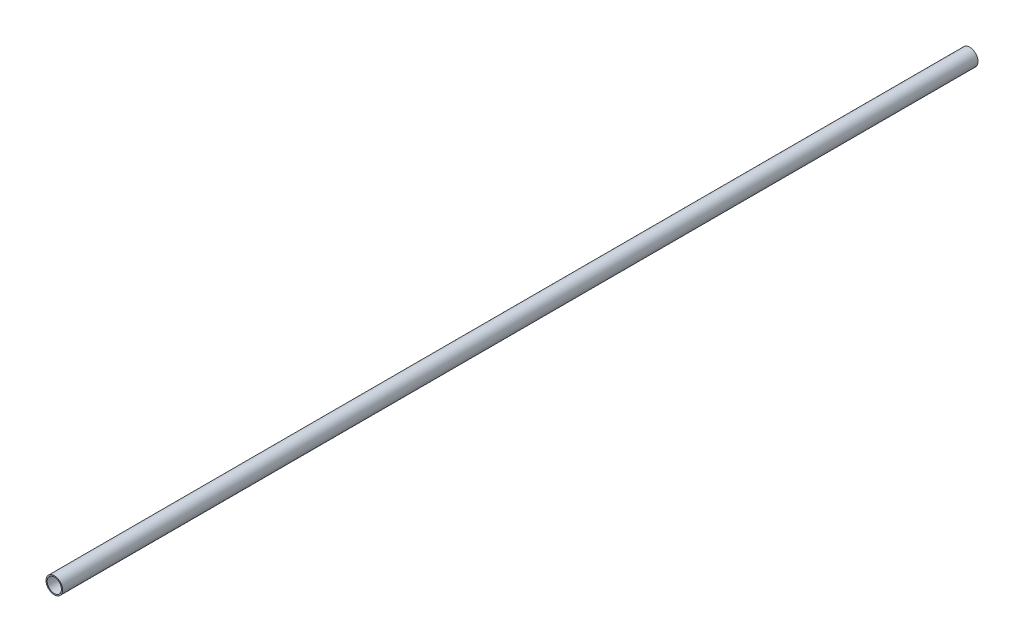
ISO-10303-21;
HEADER;
FILE_DESCRIPTION(('STEP AP214'),'2;1');
FILE_NAME('part.step','',(''),(''),'','','');
FILE_SCHEMA(('AUTOMOTIVE_DESIGN { 1 0 10303 214 1 1 1 1 }'));
ENDSEC;
DATA;
#1=APPLICATION_CONTEXT('core data for automotive mechanical design processes');
#2=APPLICATION_PROTOCOL_DEFINITION('international standard','automotive_design',2000,#1);
#3=PRODUCT_CONTEXT('',#1,'mechanical');
#4=PRODUCT('Part','Part','',(#3));
#5=PRODUCT_RELATED_PRODUCT_CATEGORY('part','',(#4));
#6=PRODUCT_DEFINITION_FORMATION('','',#4);
#7=PRODUCT_DEFINITION_CONTEXT('part definition',#1,'design');
#8=PRODUCT_DEFINITION('design','',#6,#7);
#9=PRODUCT_DEFINITION_SHAPE('','',#8);
#10=(LENGTH_UNIT() NAMED_UNIT(*) SI_UNIT(.MILLI.,.METRE.));
#11=(NAMED_UNIT(*) PLANE_ANGLE_UNIT() SI_UNIT($,.RADIAN.));
#12=(NAMED_UNIT(*) SI_UNIT($,.STERADIAN.) SOLID_ANGLE_UNIT());
#13=UNCERTAINTY_MEASURE_WITH_UNIT(LENGTH_MEASURE(1.E-05),#10,'distance_accuracy_value','');
#14=(GEOMETRIC_REPRESENTATION_CONTEXT(3) GLOBAL_UNCERTAINTY_ASSIGNED_CONTEXT((#13)) GLOBAL_UNIT_ASSIGNED_CONTEXT((#10,
#11,#12)) REPRESENTATION_CONTEXT('',''));
#15=CARTESIAN_POINT('',(0.,0.,0.));
#16=DIRECTION('',(0.,0.,1.));
#17=DIRECTION('',(1.,0.,0.));
#18=AXIS2_PLACEMENT_3D('',#15,#16,#17);
#19=CARTESIAN_POINT('',(0.,0.,609.6));
#20=DIRECTION('',(0.,0.,1.));
#21=DIRECTION('',(1.,0.,0.));
#22=AXIS2_PLACEMENT_3D('',#19,#20,#21);
#23=PLANE('',#22);
#24=CARTESIAN_POINT('',(0.,0.,609.6));
#25=DIRECTION('',(0.,0.,1.));
#26=DIRECTION('',(1.,0.,0.));
#27=AXIS2_PLACEMENT_3D('',#24,#25,#26);
#28=CIRCLE('',#27,5.5245);
#29=CARTESIAN_POINT('',(-5.5245,0.,609.6));
#30=VERTEX_POINT('',#29);
#31=EDGE_CURVE('E10',#30,#30,#28,.T.);
#32=ORIENTED_EDGE('',*,*,#31,.T.);
#33=EDGE_LOOP('',(#32));
#34=FACE_BOUND('',#33,.T.);
#35=CARTESIAN_POINT('',(0.,0.,609.6));
#36=DIRECTION('',(0.,0.,1.));
#37=DIRECTION('',(1.,0.,0.));
#38=AXIS2_PLACEMENT_3D('',#35,#36,#37);
#39=CIRCLE('',#38,4.7625);
#40=CARTESIAN_POINT('',(-4.7625,0.,609.6));
#41=VERTEX_POINT('',#40);
#42=EDGE_CURVE('E47',#41,#41,#39,.T.);
#43=ORIENTED_EDGE('',*,*,#42,.F.);
#44=EDGE_LOOP('',(#43));
#45=FACE_BOUND('',#44,.T.);
#46=ADVANCED_FACE('F36',(#34,#45),#23,.T.);
#47=CARTESIAN_POINT('',(0.,0.,0.));
#48=DIRECTION('',(0.,0.,1.));
#49=DIRECTION('',(1.,0.,0.));
#50=AXIS2_PLACEMENT_3D('',#47,#48,#49);
#51=PLANE('',#50);
#52=CARTESIAN_POINT('',(0.,0.,0.));
#53=DIRECTION('',(0.,0.,1.));
#54=DIRECTION('',(1.,0.,0.));
#55=AXIS2_PLACEMENT_3D('',#52,#53,#54);
#56=CIRCLE('',#55,5.5245);
#57=CARTESIAN_POINT('',(-5.5245,0.,0.));
#58=VERTEX_POINT('',#57);
#59=EDGE_CURVE('E40',#58,#58,#56,.T.);
#60=ORIENTED_EDGE('',*,*,#59,.F.);
#61=EDGE_LOOP('',(#60));
#62=FACE_BOUND('',#61,.T.);
#63=CARTESIAN_POINT('',(0.,0.,0.));
#64=DIRECTION('',(0.,0.,1.));
#65=DIRECTION('',(1.,0.,0.));
#66=AXIS2_PLACEMENT_3D('',#63,#64,#65);
#67=CIRCLE('',#66,4.7625);
#68=CARTESIAN_POINT('',(-4.7625,0.,0.));
#69=VERTEX_POINT('',#68);
#70=EDGE_CURVE('E49',#69,#69,#67,.T.);
#71=ORIENTED_EDGE('',*,*,#70,.T.);
#72=EDGE_LOOP('',(#71));
#73=FACE_BOUND('',#72,.T.);
#74=ADVANCED_FACE('F59',(#62,#73),#51,.F.);
#75=CARTESIAN_POINT('',(0.,0.,609.6));
#76=DIRECTION('',(0.,0.,-1.));
#77=DIRECTION('',(-1.,0.,0.));
#78=AXIS2_PLACEMENT_3D('',#75,#76,#77);
#79=CYLINDRICAL_SURFACE('',#78,5.5245);
#80=CARTESIAN_POINT('',(-5.5245,0.,609.6));
#81=CARTESIAN_POINT('',(-5.5245,0.,603.25));
#82=CARTESIAN_POINT('',(-5.5245,0.,596.9));
#83=CARTESIAN_POINT('',(-5.5245,0.,584.2));
#84=CARTESIAN_POINT('',(-5.5245,0.,577.85));
#85=CARTESIAN_POINT('',(-5.5245,0.,565.15));
#86=CARTESIAN_POINT('',(-5.5245,0.,558.8));
#87=CARTESIAN_POINT('',(-5.5245,0.,546.1));
#88=CARTESIAN_POINT('',(-5.5245,0.,539.75));
#89=CARTESIAN_POINT('',(-5.5245,0.,527.05));
#90=CARTESIAN_POINT('',(-5.5245,0.,520.7));
#91=CARTESIAN_POINT('',(-5.5245,0.,508.));
#92=CARTESIAN_POINT('',(-5.5245,0.,501.65));
#93=CARTESIAN_POINT('',(-5.5245,0.,488.95));
#94=CARTESIAN_POINT('',(-5.5245,0.,482.6));
#95=CARTESIAN_POINT('',(-5.5245,0.,469.9));
#96=CARTESIAN_POINT('',(-5.5245,0.,463.55));
#97=CARTESIAN_POINT('',(-5.5245,0.,450.85));
#98=CARTESIAN_POINT('',(-5.5245,0.,444.5));
#99=CARTESIAN_POINT('',(-5.5245,0.,431.8));
#100=CARTESIAN_POINT('',(-5.5245,0.,425.45));
#101=CARTESIAN_POINT('',(-5.5245,0.,412.75));
#102=CARTESIAN_POINT('',(-5.5245,0.,406.4));
#103=CARTESIAN_POINT('',(-5.5245,0.,393.7));
#104=CARTESIAN_POINT('',(-5.5245,0.,387.35));
#105=CARTESIAN_POINT('',(-5.5245,0.,374.65));
#106=CARTESIAN_POINT('',(-5.5245,0.,368.3));
#107=CARTESIAN_POINT('',(-5.5245,0.,355.6));
#108=CARTESIAN_POINT('',(-5.5245,0.,349.25));
#109=CARTESIAN_POINT('',(-5.5245,0.,336.55));
#110=CARTESIAN_POINT('',(-5.5245,0.,330.2));
#111=CARTESIAN_POINT('',(-5.5245,0.,317.5));
#112=CARTESIAN_POINT('',(-5.5245,0.,311.15));
#113=CARTESIAN_POINT('',(-5.5245,0.,298.45));
#114=CARTESIAN_POINT('',(-5.5245,0.,292.1));
#115=CARTESIAN_POINT('',(-5.5245,0.,279.4));
#116=CARTESIAN_POINT('',(-5.5245,0.,273.05));
#117=CARTESIAN_POINT('',(-5.5245,0.,260.35));
#118=CARTESIAN_POINT('',(-5.5245,0.,254.));
#119=CARTESIAN_POINT('',(-5.5245,0.,241.3));
#120=CARTESIAN_POINT('',(-5.5245,0.,234.95));
#121=CARTESIAN_POINT('',(-5.5245,0.,222.25));
#122=CARTESIAN_POINT('',(-5.5245,0.,215.9));
#123=CARTESIAN_POINT('',(-5.5245,0.,203.2));
#124=CARTESIAN_POINT('',(-5.5245,0.,196.85));
#125=CARTESIAN_POINT('',(-5.5245,0.,184.15));
#126=CARTESIAN_POINT('',(-5.5245,0.,177.8));
#127=CARTESIAN_POINT('',(-5.5245,0.,165.1));
#128=CARTESIAN_POINT('',(-5.5245,0.,158.75));
#129=CARTESIAN_POINT('',(-5.5245,0.,146.05));
#130=CARTESIAN_POINT('',(-5.5245,0.,139.7));
#131=CARTESIAN_POINT('',(-5.5245,0.,127.));
#132=CARTESIAN_POINT('',(-5.5245,0.,120.65));
#133=CARTESIAN_POINT('',(-5.5245,0.,107.95));
#134=CARTESIAN_POINT('',(-5.5245,0.,101.6));
#135=CARTESIAN_POINT('',(-5.5245,0.,88.9));
#136=CARTESIAN_POINT('',(-5.5245,0.,82.5500000000001));
#137=CARTESIAN_POINT('',(-5.5245,0.,69.85));
#138=CARTESIAN_POINT('',(-5.5245,0.,63.5));
#139=CARTESIAN_POINT('',(-5.5245,0.,50.8));
#140=CARTESIAN_POINT('',(-5.5245,0.,44.45));
#141=CARTESIAN_POINT('',(-5.5245,0.,31.75));
#142=CARTESIAN_POINT('',(-5.5245,0.,25.4));
#143=CARTESIAN_POINT('',(-5.5245,0.,12.7));
#144=CARTESIAN_POINT('',(-5.5245,0.,6.35000000000001));
#145=CARTESIAN_POINT('',(-5.5245,0.,0.));
#146=B_SPLINE_CURVE_WITH_KNOTS('',3,(#80,#81,#82,#83,#84,#85,#86,#87,#88,#89,#90,#91,#92,#93,
#94,#95,#96,#97,#98,#99,#100,#101,#102,#103,#104,#105,#106,#107,#108,#109,#110,#111,#112,#113,
#114,#115,#116,#117,#118,#119,#120,#121,#122,#123,#124,#125,#126,#127,#128,#129,#130,#131,#132,
#133,#134,#135,#136,#137,#138,#139,#140,#141,#142,#143,#144,#145),.UNSPECIFIED.,.F.,.F.,(4,2,2,
2,2,2,2,2,2,2,2,2,2,2,2,2,2,2,2,2,2,2,2,2,2,2,2,2,2,2,2,2,4),(0.,19.05,38.1,57.15,76.2,
95.2500000000001,114.3,133.35,152.4,171.45,190.5,209.55,228.6,247.65,266.7,285.75,304.8,323.85,
342.9,361.95,381.,400.05,419.1,438.15,457.2,476.25,495.3,514.35,533.4,552.45,571.5,590.55,
609.6),.UNSPECIFIED.);
#147=EDGE_CURVE('BSEAM38',#30,#58,#146,.T.);
#148=ORIENTED_EDGE('',*,*,#31,.F.);
#149=ORIENTED_EDGE('',*,*,#59,.T.);
#150=ORIENTED_EDGE('',*,*,#147,.T.);
#151=ORIENTED_EDGE('',*,*,#147,.F.);
#152=EDGE_LOOP('',(#148,#150,#149,#151));
#153=FACE_BOUND('',#152,.T.);
#154=ADVANCED_FACE('F38',(#153),#79,.T.);
#155=CARTESIAN_POINT('',(0.,0.,609.6));
#156=DIRECTION('',(0.,0.,-1.));
#157=DIRECTION('',(-1.,0.,0.));
#158=AXIS2_PLACEMENT_3D('',#155,#156,#157);
#159=CYLINDRICAL_SURFACE('',#158,4.7625);
#160=CARTESIAN_POINT('',(-4.7625,0.,609.6));
#161=CARTESIAN_POINT('',(-4.7625,0.,603.25));
#162=CARTESIAN_POINT('',(-4.7625,0.,596.9));
#163=CARTESIAN_POINT('',(-4.7625,0.,584.2));
#164=CARTESIAN_POINT('',(-4.7625,0.,577.85));
#165=CARTESIAN_POINT('',(-4.7625,0.,565.15));
#166=CARTESIAN_POINT('',(-4.7625,0.,558.8));
#167=CARTESIAN_POINT('',(-4.7625,0.,546.1));
#168=CARTESIAN_POINT('',(-4.7625,0.,539.75));
#169=CARTESIAN_POINT('',(-4.7625,0.,527.05));
#170=CARTESIAN_POINT('',(-4.7625,0.,520.7));
#171=CARTESIAN_POINT('',(-4.7625,0.,508.));
#172=CARTESIAN_POINT('',(-4.7625,0.,501.65));
#173=CARTESIAN_POINT('',(-4.7625,0.,488.95));
#174=CARTESIAN_POINT('',(-4.7625,0.,482.6));
#175=CARTESIAN_POINT('',(-4.7625,0.,469.9));
#176=CARTESIAN_POINT('',(-4.7625,0.,463.55));
#177=CARTESIAN_POINT('',(-4.7625,0.,450.85));
#178=CARTESIAN_POINT('',(-4.7625,0.,444.5));
#179=CARTESIAN_POINT('',(-4.7625,0.,431.8));
#180=CARTESIAN_POINT('',(-4.7625,0.,425.45));
#181=CARTESIAN_POINT('',(-4.7625,0.,412.75));
#182=CARTESIAN_POINT('',(-4.7625,0.,406.4));
#183=CARTESIAN_POINT('',(-4.7625,0.,393.7));
#184=CARTESIAN_POINT('',(-4.7625,0.,387.35));
#185=CARTESIAN_POINT('',(-4.7625,0.,374.65));
#186=CARTESIAN_POINT('',(-4.7625,0.,368.3));
#187=CARTESIAN_POINT('',(-4.7625,0.,355.6));
#188=CARTESIAN_POINT('',(-4.7625,0.,349.25));
#189=CARTESIAN_POINT('',(-4.7625,0.,336.55));
#190=CARTESIAN_POINT('',(-4.7625,0.,330.2));
#191=CARTESIAN_POINT('',(-4.7625,0.,317.5));
#192=CARTESIAN_POINT('',(-4.7625,0.,311.15));
#193=CARTESIAN_POINT('',(-4.7625,0.,298.45));
#194=CARTESIAN_POINT('',(-4.7625,0.,292.1));
#195=CARTESIAN_POINT('',(-4.7625,0.,279.4));
#196=CARTESIAN_POINT('',(-4.7625,0.,273.05));
#197=CARTESIAN_POINT('',(-4.7625,0.,260.35));
#198=CARTESIAN_POINT('',(-4.7625,0.,254.));
#199=CARTESIAN_POINT('',(-4.7625,0.,241.3));
#200=CARTESIAN_POINT('',(-4.7625,0.,234.95));
#201=CARTESIAN_POINT('',(-4.7625,0.,222.25));
#202=CARTESIAN_POINT('',(-4.7625,0.,215.9));
#203=CARTESIAN_POINT('',(-4.7625,0.,203.2));
#204=CARTESIAN_POINT('',(-4.7625,0.,196.85));
#205=CARTESIAN_POINT('',(-4.7625,0.,184.15));
#206=CARTESIAN_POINT('',(-4.7625,0.,177.8));
#207=CARTESIAN_POINT('',(-4.7625,0.,165.1));
#208=CARTESIAN_POINT('',(-4.7625,0.,158.75));
#209=CARTESIAN_POINT('',(-4.7625,0.,146.05));
#210=CARTESIAN_POINT('',(-4.7625,0.,139.7));
#211=CARTESIAN_POINT('',(-4.7625,0.,127.));
#212=CARTESIAN_POINT('',(-4.7625,0.,120.65));
#213=CARTESIAN_POINT('',(-4.7625,0.,107.95));
#214=CARTESIAN_POINT('',(-4.7625,0.,101.6));
#215=CARTESIAN_POINT('',(-4.7625,0.,88.9));
#216=CARTESIAN_POINT('',(-4.7625,0.,82.5500000000001));
#217=CARTESIAN_POINT('',(-4.7625,0.,69.85));
#218=CARTESIAN_POINT('',(-4.7625,0.,63.5));
#219=CARTESIAN_POINT('',(-4.7625,0.,50.8));
#220=CARTESIAN_POINT('',(-4.7625,0.,44.45));
#221=CARTESIAN_POINT('',(-4.7625,0.,31.75));
#222=CARTESIAN_POINT('',(-4.7625,0.,25.4));
#223=CARTESIAN_POINT('',(-4.7625,0.,12.7));
#224=CARTESIAN_POINT('',(-4.7625,0.,6.35000000000001));
#225=CARTESIAN_POINT('',(-4.7625,0.,0.));
#226=B_SPLINE_CURVE_WITH_KNOTS('',3,(#160,#161,#162,#163,#164,#165,#166,#167,#168,#169,#170,
#171,#172,#173,#174,#175,#176,#177,#178,#179,#180,#181,#182,#183,#184,#185,#186,#187,#188,#189,
#190,#191,#192,#193,#194,#195,#196,#197,#198,#199,#200,#201,#202,#203,#204,#205,#206,#207,#208,
#209,#210,#211,#212,#213,#214,#215,#216,#217,#218,#219,#220,#221,#222,#223,#224,#225),
.UNSPECIFIED.,.F.,.F.,(4,2,2,2,2,2,2,2,2,2,2,2,2,2,2,2,2,2,2,2,2,2,2,2,2,2,2,2,2,2,2,2,4),(0.,
19.0499999999999,38.0999999999999,57.1499999999999,76.1999999999999,95.2499999999999,114.3,
133.35,152.4,171.45,190.5,209.55,228.6,247.65,266.7,285.75,304.8,323.85,342.9,361.95,381.,
400.05,419.1,438.15,457.2,476.25,495.3,514.35,533.4,552.45,571.5,590.55,609.6),.UNSPECIFIED.);
#227=EDGE_CURVE('BSEAM55',#41,#69,#226,.T.);
#228=ORIENTED_EDGE('',*,*,#42,.T.);
#229=ORIENTED_EDGE('',*,*,#70,.F.);
#230=ORIENTED_EDGE('',*,*,#227,.T.);
#231=ORIENTED_EDGE('',*,*,#227,.F.);
#232=EDGE_LOOP('',(#228,#230,#229,#231));
#233=FACE_BOUND('',#232,.T.);
#234=ADVANCED_FACE('F55',(#233),#159,.F.);
#235=CLOSED_SHELL('',(#46,#74,#154,#234));
#236=MANIFOLD_SOLID_BREP('B2',#235);
#237=ADVANCED_BREP_SHAPE_REPRESENTATION('',(#18,#236),#14);
#238=SHAPE_DEFINITION_REPRESENTATION(#9,#237);
ENDSEC;
END-ISO-10303-21;
